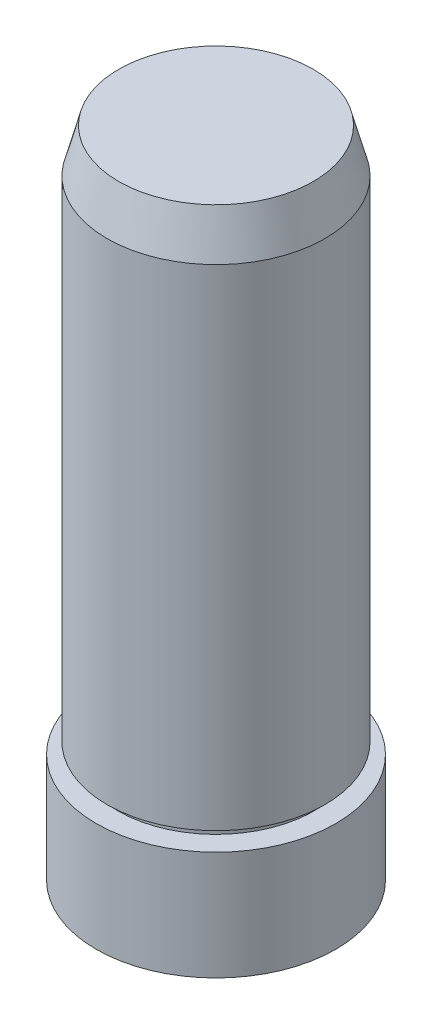
ISO-10303-21;
HEADER;
FILE_DESCRIPTION(('STEP AP214'),'2;1');
FILE_NAME('part.step','',(''),(''),'','','');
FILE_SCHEMA(('AUTOMOTIVE_DESIGN { 1 0 10303 214 1 1 1 1 }'));
ENDSEC;
DATA;
#1=APPLICATION_CONTEXT('core data for automotive mechanical design processes');
#2=APPLICATION_PROTOCOL_DEFINITION('international standard','automotive_design',2000,#1);
#3=PRODUCT_CONTEXT('',#1,'mechanical');
#4=PRODUCT('Part','Part','',(#3));
#5=PRODUCT_RELATED_PRODUCT_CATEGORY('part','',(#4));
#6=PRODUCT_DEFINITION_FORMATION('','',#4);
#7=PRODUCT_DEFINITION_CONTEXT('part definition',#1,'design');
#8=PRODUCT_DEFINITION('design','',#6,#7);
#9=PRODUCT_DEFINITION_SHAPE('','',#8);
#10=(LENGTH_UNIT() NAMED_UNIT(*) SI_UNIT(.MILLI.,.METRE.));
#11=(NAMED_UNIT(*) PLANE_ANGLE_UNIT() SI_UNIT($,.RADIAN.));
#12=(NAMED_UNIT(*) SI_UNIT($,.STERADIAN.) SOLID_ANGLE_UNIT());
#13=UNCERTAINTY_MEASURE_WITH_UNIT(LENGTH_MEASURE(1.E-05),#10,'distance_accuracy_value','');
#14=(GEOMETRIC_REPRESENTATION_CONTEXT(3) GLOBAL_UNCERTAINTY_ASSIGNED_CONTEXT((#13)) GLOBAL_UNIT_ASSIGNED_CONTEXT((#10,
#11,#12)) REPRESENTATION_CONTEXT('',''));
#15=CARTESIAN_POINT('',(0.,0.,0.));
#16=DIRECTION('',(0.,0.,1.));
#17=DIRECTION('',(1.,0.,0.));
#18=AXIS2_PLACEMENT_3D('',#15,#16,#17);
#19=CARTESIAN_POINT('',(0.,50.,0.));
#20=DIRECTION('',(0.,-1.,0.));
#21=DIRECTION('',(0.,0.,-1.));
#22=AXIS2_PLACEMENT_3D('',#19,#20,#21);
#23=CYLINDRICAL_SURFACE('',#22,9.99999999999999);
#24=CARTESIAN_POINT('',(0.,1.,0.));
#25=DIRECTION('',(0.,1.,0.));
#26=DIRECTION('',(0.,0.,1.));
#27=AXIS2_PLACEMENT_3D('',#24,#25,#26);
#28=CIRCLE('',#27,9.99999999999999);
#29=CARTESIAN_POINT('',(0.,1.,9.99999999999999));
#30=VERTEX_POINT('',#29);
#31=EDGE_CURVE('E53',#30,#30,#28,.T.);
#32=ORIENTED_EDGE('',*,*,#31,.T.);
#33=EDGE_LOOP('',(#32));
#34=FACE_BOUND('',#33,.T.);
#35=CARTESIAN_POINT('',(0.,46.,0.));
#36=DIRECTION('',(0.,1.,0.));
#37=DIRECTION('',(0.,0.,1.));
#38=AXIS2_PLACEMENT_3D('',#35,#36,#37);
#39=CIRCLE('',#38,9.99999999999999);
#40=CARTESIAN_POINT('',(0.,46.,9.99999999999999));
#41=VERTEX_POINT('',#40);
#42=EDGE_CURVE('E10',#41,#41,#39,.F.);
#43=ORIENTED_EDGE('',*,*,#42,.T.);
#44=EDGE_LOOP('',(#43));
#45=FACE_BOUND('',#44,.T.);
#46=ADVANCED_FACE('F34',(#34,#45),#23,.T.);
#47=CARTESIAN_POINT('',(0.,50.,0.));
#48=DIRECTION('',(0.,1.,0.));
#49=DIRECTION('',(0.,0.,1.));
#50=AXIS2_PLACEMENT_3D('',#47,#48,#49);
#51=PLANE('',#50);
#52=CARTESIAN_POINT('',(0.,50.,0.));
#53=DIRECTION('',(0.,1.,0.));
#54=DIRECTION('',(0.,0.,1.));
#55=AXIS2_PLACEMENT_3D('',#52,#53,#54);
#56=CIRCLE('',#55,8.9282032302755);
#57=CARTESIAN_POINT('',(0.,50.,8.9282032302755));
#58=VERTEX_POINT('',#57);
#59=EDGE_CURVE('E41',#58,#58,#56,.T.);
#60=ORIENTED_EDGE('',*,*,#59,.T.);
#61=EDGE_LOOP('',(#60));
#62=FACE_BOUND('',#61,.T.);
#63=ADVANCED_FACE('F86',(#62),#51,.T.);
#64=CARTESIAN_POINT('',(0.,50.,0.));
#65=DIRECTION('',(0.,-1.,0.));
#66=DIRECTION('',(0.,0.,-1.));
#67=AXIS2_PLACEMENT_3D('',#64,#65,#66);
#68=CONICAL_SURFACE('',#67,8.9282032302755,0.261799387799148);
#69=ORIENTED_EDGE('',*,*,#42,.F.);
#70=EDGE_LOOP('',(#69));
#71=FACE_BOUND('',#70,.T.);
#72=ORIENTED_EDGE('',*,*,#59,.F.);
#73=EDGE_LOOP('',(#72));
#74=FACE_BOUND('',#73,.T.);
#75=ADVANCED_FACE('F36',(#71,#74),#68,.T.);
#76=CARTESIAN_POINT('',(0.,1.,0.));
#77=DIRECTION('',(0.,1.,0.));
#78=DIRECTION('',(0.,0.,1.));
#79=AXIS2_PLACEMENT_3D('',#76,#77,#78);
#80=PLANE('',#79);
#81=ORIENTED_EDGE('',*,*,#31,.F.);
#82=EDGE_LOOP('',(#81));
#83=FACE_BOUND('',#82,.T.);
#84=CARTESIAN_POINT('',(0.,1.,0.));
#85=DIRECTION('',(0.,1.,0.));
#86=DIRECTION('',(0.,0.,1.));
#87=AXIS2_PLACEMENT_3D('',#84,#85,#86);
#88=CIRCLE('',#87,8.99999999999999);
#89=CARTESIAN_POINT('',(0.,1.,8.99999999999999));
#90=VERTEX_POINT('',#89);
#91=EDGE_CURVE('E57',#90,#90,#88,.T.);
#92=ORIENTED_EDGE('',*,*,#91,.T.);
#93=EDGE_LOOP('',(#92));
#94=FACE_BOUND('',#93,.T.);
#95=ADVANCED_FACE('F64',(#83,#94),#80,.F.);
#96=CARTESIAN_POINT('',(0.,1.,0.));
#97=DIRECTION('',(0.,-1.,0.));
#98=DIRECTION('',(0.,0.,-1.));
#99=AXIS2_PLACEMENT_3D('',#96,#97,#98);
#100=CYLINDRICAL_SURFACE('',#99,8.99999999999999);
#101=ORIENTED_EDGE('',*,*,#91,.F.);
#102=EDGE_LOOP('',(#101));
#103=FACE_BOUND('',#102,.T.);
#104=CARTESIAN_POINT('',(0.,0.,0.));
#105=DIRECTION('',(0.,1.,0.));
#106=DIRECTION('',(0.,0.,1.));
#107=AXIS2_PLACEMENT_3D('',#104,#105,#106);
#108=CIRCLE('',#107,8.99999999999999);
#109=CARTESIAN_POINT('',(0.,0.,8.99999999999999));
#110=VERTEX_POINT('',#109);
#111=EDGE_CURVE('E58',#110,#110,#108,.T.);
#112=ORIENTED_EDGE('',*,*,#111,.T.);
#113=EDGE_LOOP('',(#112));
#114=FACE_BOUND('',#113,.T.);
#115=ADVANCED_FACE('F66',(#103,#114),#100,.T.);
#116=CARTESIAN_POINT('',(0.,-10.,0.));
#117=DIRECTION('',(0.,-1.,0.));
#118=DIRECTION('',(0.,0.,-1.));
#119=AXIS2_PLACEMENT_3D('',#116,#117,#118);
#120=PLANE('',#119);
#121=CARTESIAN_POINT('',(0.,-10.,0.));
#122=DIRECTION('',(0.,-1.,0.));
#123=DIRECTION('',(0.,0.,-1.));
#124=AXIS2_PLACEMENT_3D('',#121,#122,#123);
#125=CIRCLE('',#124,11.);
#126=CARTESIAN_POINT('',(0.,-10.,-11.));
#127=VERTEX_POINT('',#126);
#128=EDGE_CURVE('E45',#127,#127,#125,.T.);
#129=ORIENTED_EDGE('',*,*,#128,.T.);
#130=EDGE_LOOP('',(#129));
#131=FACE_BOUND('',#130,.T.);
#132=ADVANCED_FACE('F69',(#131),#120,.T.);
#133=CARTESIAN_POINT('',(0.,-10.,0.));
#134=DIRECTION('',(0.,1.,0.));
#135=DIRECTION('',(0.,0.,1.));
#136=AXIS2_PLACEMENT_3D('',#133,#134,#135);
#137=CYLINDRICAL_SURFACE('',#136,11.);
#138=ORIENTED_EDGE('',*,*,#128,.F.);
#139=EDGE_LOOP('',(#138));
#140=FACE_BOUND('',#139,.T.);
#141=CARTESIAN_POINT('',(0.,0.,0.));
#142=DIRECTION('',(0.,-1.,0.));
#143=DIRECTION('',(0.,0.,-1.));
#144=AXIS2_PLACEMENT_3D('',#141,#142,#143);
#145=CIRCLE('',#144,11.);
#146=CARTESIAN_POINT('',(0.,0.,-11.));
#147=VERTEX_POINT('',#146);
#148=EDGE_CURVE('E49',#147,#147,#145,.T.);
#149=ORIENTED_EDGE('',*,*,#148,.T.);
#150=EDGE_LOOP('',(#149));
#151=FACE_BOUND('',#150,.T.);
#152=ADVANCED_FACE('F75',(#140,#151),#137,.T.);
#153=CARTESIAN_POINT('',(0.,0.,0.));
#154=DIRECTION('',(0.,-1.,0.));
#155=DIRECTION('',(0.,0.,-1.));
#156=AXIS2_PLACEMENT_3D('',#153,#154,#155);
#157=PLANE('',#156);
#158=ORIENTED_EDGE('',*,*,#148,.F.);
#159=EDGE_LOOP('',(#158));
#160=FACE_BOUND('',#159,.T.);
#161=ORIENTED_EDGE('',*,*,#111,.F.);
#162=EDGE_LOOP('',(#161));
#163=FACE_BOUND('',#162,.T.);
#164=ADVANCED_FACE('F73',(#160,#163),#157,.F.);
#165=CLOSED_SHELL('',(#46,#63,#75,#95,#115,#132,#152,#164));
#166=MANIFOLD_SOLID_BREP('B2',#165);
#167=ADVANCED_BREP_SHAPE_REPRESENTATION('',(#18,#166),#14);
#168=SHAPE_DEFINITION_REPRESENTATION(#9,#167);
ENDSEC;
END-ISO-10303-21;
